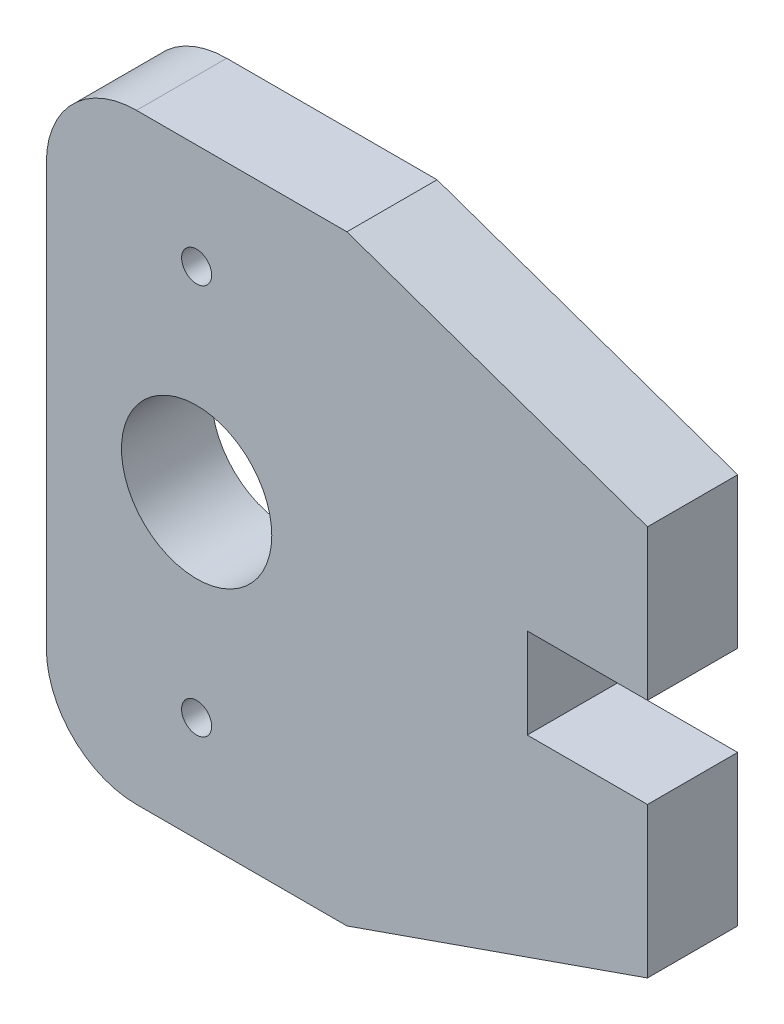
ISO-10303-21;
HEADER;
FILE_DESCRIPTION(('STEP AP214'),'2;1');
FILE_NAME('part.step','',(''),(''),'','','');
FILE_SCHEMA(('AUTOMOTIVE_DESIGN { 1 0 10303 214 1 1 1 1 }'));
ENDSEC;
DATA;
#1=APPLICATION_CONTEXT('core data for automotive mechanical design processes');
#2=APPLICATION_PROTOCOL_DEFINITION('international standard','automotive_design',2000,#1);
#3=PRODUCT_CONTEXT('',#1,'mechanical');
#4=PRODUCT('Part','Part','',(#3));
#5=PRODUCT_RELATED_PRODUCT_CATEGORY('part','',(#4));
#6=PRODUCT_DEFINITION_FORMATION('','',#4);
#7=PRODUCT_DEFINITION_CONTEXT('part definition',#1,'design');
#8=PRODUCT_DEFINITION('design','',#6,#7);
#9=PRODUCT_DEFINITION_SHAPE('','',#8);
#10=(LENGTH_UNIT() NAMED_UNIT(*) SI_UNIT(.MILLI.,.METRE.));
#11=(NAMED_UNIT(*) PLANE_ANGLE_UNIT() SI_UNIT($,.RADIAN.));
#12=(NAMED_UNIT(*) SI_UNIT($,.STERADIAN.) SOLID_ANGLE_UNIT());
#13=UNCERTAINTY_MEASURE_WITH_UNIT(LENGTH_MEASURE(1.E-05),#10,'distance_accuracy_value','');
#14=(GEOMETRIC_REPRESENTATION_CONTEXT(3) GLOBAL_UNCERTAINTY_ASSIGNED_CONTEXT((#13)) GLOBAL_UNIT_ASSIGNED_CONTEXT((#10,
#11,#12)) REPRESENTATION_CONTEXT('',''));
#15=CARTESIAN_POINT('',(0.,0.,0.));
#16=DIRECTION('',(0.,0.,1.));
#17=DIRECTION('',(1.,0.,0.));
#18=AXIS2_PLACEMENT_3D('',#15,#16,#17);
#19=CARTESIAN_POINT('',(0.,0.,3.));
#20=DIRECTION('',(0.,0.,1.));
#21=DIRECTION('',(1.,0.,0.));
#22=AXIS2_PLACEMENT_3D('',#19,#20,#21);
#23=PLANE('',#22);
#24=CARTESIAN_POINT('',(-5.,0.,3.));
#25=DIRECTION('',(0.,0.,1.));
#26=DIRECTION('',(1.,0.,0.));
#27=AXIS2_PLACEMENT_3D('',#24,#25,#26);
#28=CIRCLE('',#27,2.5);
#29=CARTESIAN_POINT('',(-2.5,0.,3.));
#30=VERTEX_POINT('',#29);
#31=EDGE_CURVE('E404',#30,#30,#28,.T.);
#32=ORIENTED_EDGE('',*,*,#31,.F.);
#33=EDGE_LOOP('',(#32));
#34=FACE_BOUND('',#33,.T.);
#35=CARTESIAN_POINT('',(-5.,6.5,3.));
#36=DIRECTION('',(0.,0.,1.));
#37=DIRECTION('',(1.,0.,0.));
#38=AXIS2_PLACEMENT_3D('',#35,#36,#37);
#39=CIRCLE('',#38,0.5);
#40=CARTESIAN_POINT('',(-4.5,6.5,3.));
#41=VERTEX_POINT('',#40);
#42=EDGE_CURVE('E168',#41,#41,#39,.T.);
#43=ORIENTED_EDGE('',*,*,#42,.F.);
#44=EDGE_LOOP('',(#43));
#45=FACE_BOUND('',#44,.T.);
#46=DIRECTION('',(0.,-1.,0.));
#47=VECTOR('',#46,1.);
#48=CARTESIAN_POINT('',(-10.,10.,3.));
#49=LINE('',#48,#47);
#50=CARTESIAN_POINT('',(-10.,7.,3.));
#51=VERTEX_POINT('',#50);
#52=CARTESIAN_POINT('',(-10.,-7.,3.));
#53=VERTEX_POINT('',#52);
#54=EDGE_CURVE('E133',#51,#53,#49,.T.);
#55=ORIENTED_EDGE('',*,*,#54,.T.);
#56=CARTESIAN_POINT('',(-7.,-7.,3.));
#57=DIRECTION('',(0.,0.,1.));
#58=DIRECTION('',(1.,0.,0.));
#59=AXIS2_PLACEMENT_3D('',#56,#57,#58);
#60=CIRCLE('',#59,3.);
#61=CARTESIAN_POINT('',(-7.,-10.,3.));
#62=VERTEX_POINT('',#61);
#63=EDGE_CURVE('E41',#53,#62,#60,.T.);
#64=ORIENTED_EDGE('',*,*,#63,.T.);
#65=DIRECTION('',(1.,0.,0.));
#66=VECTOR('',#65,1.);
#67=CARTESIAN_POINT('',(-10.,-10.,3.));
#68=LINE('',#67,#66);
#69=CARTESIAN_POINT('',(0.,-10.,3.));
#70=VERTEX_POINT('',#69);
#71=EDGE_CURVE('E123',#62,#70,#68,.T.);
#72=ORIENTED_EDGE('',*,*,#71,.T.);
#73=DIRECTION('',(0.943858356366017,0.330350424728106,0.));
#74=VECTOR('',#73,1.);
#75=CARTESIAN_POINT('',(0.,-10.,3.));
#76=LINE('',#75,#74);
#77=CARTESIAN_POINT('',(10.,-6.5,3.));
#78=VERTEX_POINT('',#77);
#79=EDGE_CURVE('E127',#70,#78,#76,.T.);
#80=ORIENTED_EDGE('',*,*,#79,.T.);
#81=DIRECTION('',(0.,1.,0.));
#82=VECTOR('',#81,1.);
#83=CARTESIAN_POINT('',(10.,-1.5,3.));
#84=LINE('',#83,#82);
#85=CARTESIAN_POINT('',(10.,-1.5,3.));
#86=VERTEX_POINT('',#85);
#87=EDGE_CURVE('E148',#78,#86,#84,.T.);
#88=ORIENTED_EDGE('',*,*,#87,.T.);
#89=DIRECTION('',(-1.,0.,0.));
#90=VECTOR('',#89,1.);
#91=CARTESIAN_POINT('',(6.,-1.5,3.));
#92=LINE('',#91,#90);
#93=CARTESIAN_POINT('',(6.,-1.5,3.));
#94=VERTEX_POINT('',#93);
#95=EDGE_CURVE('E150',#86,#94,#92,.T.);
#96=ORIENTED_EDGE('',*,*,#95,.T.);
#97=DIRECTION('',(0.,1.,0.));
#98=VECTOR('',#97,1.);
#99=CARTESIAN_POINT('',(6.,-1.5,3.));
#100=LINE('',#99,#98);
#101=CARTESIAN_POINT('',(6.,1.5,3.));
#102=VERTEX_POINT('',#101);
#103=EDGE_CURVE('E155',#94,#102,#100,.T.);
#104=ORIENTED_EDGE('',*,*,#103,.T.);
#105=DIRECTION('',(1.,0.,0.));
#106=VECTOR('',#105,1.);
#107=CARTESIAN_POINT('',(6.,1.5,3.));
#108=LINE('',#107,#106);
#109=CARTESIAN_POINT('',(10.,1.5,3.));
#110=VERTEX_POINT('',#109);
#111=EDGE_CURVE('E157',#102,#110,#108,.T.);
#112=ORIENTED_EDGE('',*,*,#111,.T.);
#113=DIRECTION('',(0.,1.,0.));
#114=VECTOR('',#113,1.);
#115=CARTESIAN_POINT('',(10.,6.5,3.));
#116=LINE('',#115,#114);
#117=CARTESIAN_POINT('',(10.,6.5,3.));
#118=VERTEX_POINT('',#117);
#119=EDGE_CURVE('E159',#110,#118,#116,.T.);
#120=ORIENTED_EDGE('',*,*,#119,.T.);
#121=DIRECTION('',(-0.943858356366017,0.330350424728106,0.));
#122=VECTOR('',#121,1.);
#123=CARTESIAN_POINT('',(0.,10.,3.));
#124=LINE('',#123,#122);
#125=CARTESIAN_POINT('',(0.,10.,3.));
#126=VERTEX_POINT('',#125);
#127=EDGE_CURVE('E161',#118,#126,#124,.T.);
#128=ORIENTED_EDGE('',*,*,#127,.T.);
#129=DIRECTION('',(-1.,0.,0.));
#130=VECTOR('',#129,1.);
#131=CARTESIAN_POINT('',(-10.,10.,3.));
#132=LINE('',#131,#130);
#133=CARTESIAN_POINT('',(-7.,10.,3.));
#134=VERTEX_POINT('',#133);
#135=EDGE_CURVE('E163',#126,#134,#132,.T.);
#136=ORIENTED_EDGE('',*,*,#135,.T.);
#137=CARTESIAN_POINT('',(-7.,7.,3.));
#138=DIRECTION('',(0.,0.,1.));
#139=DIRECTION('',(1.,0.,0.));
#140=AXIS2_PLACEMENT_3D('',#137,#138,#139);
#141=CIRCLE('',#140,3.);
#142=EDGE_CURVE('E213',#134,#51,#141,.T.);
#143=ORIENTED_EDGE('',*,*,#142,.T.);
#144=EDGE_LOOP('',(#55,#64,#72,#80,#88,#96,#104,#112,#120,#128,#136,#143));
#145=FACE_BOUND('',#144,.T.);
#146=CARTESIAN_POINT('',(-5.,-6.5,3.));
#147=DIRECTION('',(0.,0.,1.));
#148=DIRECTION('',(1.,0.,0.));
#149=AXIS2_PLACEMENT_3D('',#146,#147,#148);
#150=CIRCLE('',#149,0.5);
#151=CARTESIAN_POINT('',(-4.5,-6.5,3.));
#152=VERTEX_POINT('',#151);
#153=EDGE_CURVE('E409',#152,#152,#150,.T.);
#154=ORIENTED_EDGE('',*,*,#153,.F.);
#155=EDGE_LOOP('',(#154));
#156=FACE_BOUND('',#155,.T.);
#157=ADVANCED_FACE('F33',(#34,#45,#145,#156),#23,.T.);
#158=CARTESIAN_POINT('',(0.,0.,0.));
#159=DIRECTION('',(0.,0.,1.));
#160=DIRECTION('',(1.,0.,0.));
#161=AXIS2_PLACEMENT_3D('',#158,#159,#160);
#162=PLANE('',#161);
#163=CARTESIAN_POINT('',(-5.,0.,0.));
#164=DIRECTION('',(0.,0.,1.));
#165=DIRECTION('',(1.,0.,0.));
#166=AXIS2_PLACEMENT_3D('',#163,#164,#165);
#167=CIRCLE('',#166,2.5);
#168=CARTESIAN_POINT('',(-2.5,0.,0.));
#169=VERTEX_POINT('',#168);
#170=EDGE_CURVE('E402',#169,#169,#167,.T.);
#171=ORIENTED_EDGE('',*,*,#170,.T.);
#172=EDGE_LOOP('',(#171));
#173=FACE_BOUND('',#172,.T.);
#174=DIRECTION('',(1.,0.,0.));
#175=VECTOR('',#174,1.);
#176=CARTESIAN_POINT('',(-10.,-10.,0.));
#177=LINE('',#176,#175);
#178=CARTESIAN_POINT('',(-7.,-10.,0.));
#179=VERTEX_POINT('',#178);
#180=CARTESIAN_POINT('',(0.,-10.,0.));
#181=VERTEX_POINT('',#180);
#182=EDGE_CURVE('E139',#179,#181,#177,.T.);
#183=ORIENTED_EDGE('',*,*,#182,.F.);
#184=CARTESIAN_POINT('',(-7.,-7.,0.));
#185=DIRECTION('',(0.,0.,1.));
#186=DIRECTION('',(1.,0.,0.));
#187=AXIS2_PLACEMENT_3D('',#184,#185,#186);
#188=CIRCLE('',#187,3.);
#189=CARTESIAN_POINT('',(-10.,-7.,0.));
#190=VERTEX_POINT('',#189);
#191=EDGE_CURVE('E207',#179,#190,#188,.F.);
#192=ORIENTED_EDGE('',*,*,#191,.T.);
#193=DIRECTION('',(0.,-1.,0.));
#194=VECTOR('',#193,1.);
#195=CARTESIAN_POINT('',(-10.,10.,0.));
#196=LINE('',#195,#194);
#197=CARTESIAN_POINT('',(-10.,7.,0.));
#198=VERTEX_POINT('',#197);
#199=EDGE_CURVE('E166',#198,#190,#196,.T.);
#200=ORIENTED_EDGE('',*,*,#199,.F.);
#201=CARTESIAN_POINT('',(-7.,7.,0.));
#202=DIRECTION('',(0.,0.,1.));
#203=DIRECTION('',(1.,0.,0.));
#204=AXIS2_PLACEMENT_3D('',#201,#202,#203);
#205=CIRCLE('',#204,3.);
#206=CARTESIAN_POINT('',(-7.,10.,0.));
#207=VERTEX_POINT('',#206);
#208=EDGE_CURVE('E205',#198,#207,#205,.F.);
#209=ORIENTED_EDGE('',*,*,#208,.T.);
#210=DIRECTION('',(-1.,0.,0.));
#211=VECTOR('',#210,1.);
#212=CARTESIAN_POINT('',(-10.,10.,0.));
#213=LINE('',#212,#211);
#214=CARTESIAN_POINT('',(0.,10.,0.));
#215=VERTEX_POINT('',#214);
#216=EDGE_CURVE('E184',#215,#207,#213,.T.);
#217=ORIENTED_EDGE('',*,*,#216,.F.);
#218=DIRECTION('',(-0.943858356366017,0.330350424728106,0.));
#219=VECTOR('',#218,1.);
#220=CARTESIAN_POINT('',(0.,10.,0.));
#221=LINE('',#220,#219);
#222=CARTESIAN_POINT('',(10.,6.5,0.));
#223=VERTEX_POINT('',#222);
#224=EDGE_CURVE('E182',#223,#215,#221,.T.);
#225=ORIENTED_EDGE('',*,*,#224,.F.);
#226=DIRECTION('',(0.,1.,0.));
#227=VECTOR('',#226,1.);
#228=CARTESIAN_POINT('',(10.,6.5,0.));
#229=LINE('',#228,#227);
#230=CARTESIAN_POINT('',(10.,1.5,0.));
#231=VERTEX_POINT('',#230);
#232=EDGE_CURVE('E180',#231,#223,#229,.T.);
#233=ORIENTED_EDGE('',*,*,#232,.F.);
#234=DIRECTION('',(1.,0.,0.));
#235=VECTOR('',#234,1.);
#236=CARTESIAN_POINT('',(6.,1.5,0.));
#237=LINE('',#236,#235);
#238=CARTESIAN_POINT('',(6.,1.5,0.));
#239=VERTEX_POINT('',#238);
#240=EDGE_CURVE('E178',#239,#231,#237,.T.);
#241=ORIENTED_EDGE('',*,*,#240,.F.);
#242=DIRECTION('',(0.,1.,0.));
#243=VECTOR('',#242,1.);
#244=CARTESIAN_POINT('',(6.,-1.5,0.));
#245=LINE('',#244,#243);
#246=CARTESIAN_POINT('',(6.,-1.5,0.));
#247=VERTEX_POINT('',#246);
#248=EDGE_CURVE('E176',#247,#239,#245,.T.);
#249=ORIENTED_EDGE('',*,*,#248,.F.);
#250=DIRECTION('',(-1.,0.,0.));
#251=VECTOR('',#250,1.);
#252=CARTESIAN_POINT('',(6.,-1.5,0.));
#253=LINE('',#252,#251);
#254=CARTESIAN_POINT('',(10.,-1.5,0.));
#255=VERTEX_POINT('',#254);
#256=EDGE_CURVE('E174',#255,#247,#253,.T.);
#257=ORIENTED_EDGE('',*,*,#256,.F.);
#258=DIRECTION('',(0.,1.,0.));
#259=VECTOR('',#258,1.);
#260=CARTESIAN_POINT('',(10.,-1.5,0.));
#261=LINE('',#260,#259);
#262=CARTESIAN_POINT('',(10.,-6.5,0.));
#263=VERTEX_POINT('',#262);
#264=EDGE_CURVE('E172',#263,#255,#261,.T.);
#265=ORIENTED_EDGE('',*,*,#264,.F.);
#266=DIRECTION('',(0.943858356366017,0.330350424728106,0.));
#267=VECTOR('',#266,1.);
#268=CARTESIAN_POINT('',(0.,-10.,0.));
#269=LINE('',#268,#267);
#270=EDGE_CURVE('E170',#181,#263,#269,.T.);
#271=ORIENTED_EDGE('',*,*,#270,.F.);
#272=EDGE_LOOP('',(#183,#192,#200,#209,#217,#225,#233,#241,#249,#257,#265,#271));
#273=FACE_BOUND('',#272,.T.);
#274=CARTESIAN_POINT('',(-5.,6.5,0.));
#275=DIRECTION('',(0.,0.,1.));
#276=DIRECTION('',(1.,0.,0.));
#277=AXIS2_PLACEMENT_3D('',#274,#275,#276);
#278=CIRCLE('',#277,0.5);
#279=CARTESIAN_POINT('',(-4.5,6.5,0.));
#280=VERTEX_POINT('',#279);
#281=EDGE_CURVE('E412',#280,#280,#278,.T.);
#282=ORIENTED_EDGE('',*,*,#281,.T.);
#283=EDGE_LOOP('',(#282));
#284=FACE_BOUND('',#283,.T.);
#285=CARTESIAN_POINT('',(-5.,-6.5,0.));
#286=DIRECTION('',(0.,0.,1.));
#287=DIRECTION('',(1.,0.,0.));
#288=AXIS2_PLACEMENT_3D('',#285,#286,#287);
#289=CIRCLE('',#288,0.5);
#290=CARTESIAN_POINT('',(-4.5,-6.5,0.));
#291=VERTEX_POINT('',#290);
#292=EDGE_CURVE('E406',#291,#291,#289,.T.);
#293=ORIENTED_EDGE('',*,*,#292,.T.);
#294=EDGE_LOOP('',(#293));
#295=FACE_BOUND('',#294,.T.);
#296=ADVANCED_FACE('F221',(#173,#273,#284,#295),#162,.F.);
#297=CARTESIAN_POINT('',(-10.,10.,3.));
#298=DIRECTION('',(1.,0.,0.));
#299=DIRECTION('',(0.,1.,0.));
#300=AXIS2_PLACEMENT_3D('',#297,#298,#299);
#301=PLANE('',#300);
#302=ORIENTED_EDGE('',*,*,#199,.T.);
#303=DIRECTION('',(0.,0.,-1.));
#304=VECTOR('',#303,1.);
#305=CARTESIAN_POINT('',(-10.,-7.,3.));
#306=LINE('',#305,#304);
#307=EDGE_CURVE('E54',#190,#53,#306,.F.);
#308=ORIENTED_EDGE('',*,*,#307,.T.);
#309=ORIENTED_EDGE('',*,*,#54,.F.);
#310=DIRECTION('',(0.,0.,-1.));
#311=VECTOR('',#310,1.);
#312=CARTESIAN_POINT('',(-10.,7.,3.));
#313=LINE('',#312,#311);
#314=EDGE_CURVE('E209',#51,#198,#313,.T.);
#315=ORIENTED_EDGE('',*,*,#314,.T.);
#316=EDGE_LOOP('',(#302,#308,#309,#315));
#317=FACE_BOUND('',#316,.T.);
#318=ADVANCED_FACE('F217',(#317),#301,.F.);
#319=CARTESIAN_POINT('',(-10.,-10.,3.));
#320=DIRECTION('',(0.,1.,0.));
#321=DIRECTION('',(0.,0.,1.));
#322=AXIS2_PLACEMENT_3D('',#319,#320,#321);
#323=PLANE('',#322);
#324=ORIENTED_EDGE('',*,*,#71,.F.);
#325=DIRECTION('',(0.,0.,-1.));
#326=VECTOR('',#325,1.);
#327=CARTESIAN_POINT('',(-7.,-10.,3.));
#328=LINE('',#327,#326);
#329=EDGE_CURVE('E142',#62,#179,#328,.T.);
#330=ORIENTED_EDGE('',*,*,#329,.T.);
#331=ORIENTED_EDGE('',*,*,#182,.T.);
#332=DIRECTION('',(0.,0.,-1.));
#333=VECTOR('',#332,1.);
#334=CARTESIAN_POINT('',(0.,-10.,3.));
#335=LINE('',#334,#333);
#336=EDGE_CURVE('E136',#70,#181,#335,.T.);
#337=ORIENTED_EDGE('',*,*,#336,.F.);
#338=EDGE_LOOP('',(#324,#330,#331,#337));
#339=FACE_BOUND('',#338,.T.);
#340=ADVANCED_FACE('F137',(#339),#323,.F.);
#341=CARTESIAN_POINT('',(0.,-10.,3.));
#342=DIRECTION('',(-0.330350424728106,0.943858356366017,0.));
#343=DIRECTION('',(-0.943858356366018,-0.330350424728106,0.));
#344=AXIS2_PLACEMENT_3D('',#341,#342,#343);
#345=PLANE('',#344);
#346=ORIENTED_EDGE('',*,*,#270,.T.);
#347=DIRECTION('',(0.,0.,-1.));
#348=VECTOR('',#347,1.);
#349=CARTESIAN_POINT('',(10.,-6.5,3.));
#350=LINE('',#349,#348);
#351=EDGE_CURVE('E143',#78,#263,#350,.T.);
#352=ORIENTED_EDGE('',*,*,#351,.F.);
#353=ORIENTED_EDGE('',*,*,#79,.F.);
#354=ORIENTED_EDGE('',*,*,#336,.T.);
#355=EDGE_LOOP('',(#346,#352,#353,#354));
#356=FACE_BOUND('',#355,.T.);
#357=ADVANCED_FACE('F145',(#356),#345,.F.);
#358=CARTESIAN_POINT('',(10.,-1.5,3.));
#359=DIRECTION('',(-1.,0.,0.));
#360=DIRECTION('',(0.,0.,1.));
#361=AXIS2_PLACEMENT_3D('',#358,#359,#360);
#362=PLANE('',#361);
#363=ORIENTED_EDGE('',*,*,#264,.T.);
#364=DIRECTION('',(0.,0.,-1.));
#365=VECTOR('',#364,1.);
#366=CARTESIAN_POINT('',(10.,-1.5,3.));
#367=LINE('',#366,#365);
#368=EDGE_CURVE('E200',#86,#255,#367,.T.);
#369=ORIENTED_EDGE('',*,*,#368,.F.);
#370=ORIENTED_EDGE('',*,*,#87,.F.);
#371=ORIENTED_EDGE('',*,*,#351,.T.);
#372=EDGE_LOOP('',(#363,#369,#370,#371));
#373=FACE_BOUND('',#372,.T.);
#374=ADVANCED_FACE('F252',(#373),#362,.F.);
#375=CARTESIAN_POINT('',(6.,-1.5,3.));
#376=DIRECTION('',(0.,-1.,0.));
#377=DIRECTION('',(1.,0.,0.));
#378=AXIS2_PLACEMENT_3D('',#375,#376,#377);
#379=PLANE('',#378);
#380=ORIENTED_EDGE('',*,*,#256,.T.);
#381=DIRECTION('',(0.,0.,-1.));
#382=VECTOR('',#381,1.);
#383=CARTESIAN_POINT('',(6.,-1.5,3.));
#384=LINE('',#383,#382);
#385=EDGE_CURVE('E197',#94,#247,#384,.T.);
#386=ORIENTED_EDGE('',*,*,#385,.F.);
#387=ORIENTED_EDGE('',*,*,#95,.F.);
#388=ORIENTED_EDGE('',*,*,#368,.T.);
#389=EDGE_LOOP('',(#380,#386,#387,#388));
#390=FACE_BOUND('',#389,.T.);
#391=ADVANCED_FACE('F248',(#390),#379,.F.);
#392=CARTESIAN_POINT('',(6.,-1.5,3.));
#393=DIRECTION('',(-1.,0.,0.));
#394=DIRECTION('',(0.,0.,1.));
#395=AXIS2_PLACEMENT_3D('',#392,#393,#394);
#396=PLANE('',#395);
#397=ORIENTED_EDGE('',*,*,#248,.T.);
#398=DIRECTION('',(0.,0.,-1.));
#399=VECTOR('',#398,1.);
#400=CARTESIAN_POINT('',(6.,1.5,3.));
#401=LINE('',#400,#399);
#402=EDGE_CURVE('E194',#102,#239,#401,.T.);
#403=ORIENTED_EDGE('',*,*,#402,.F.);
#404=ORIENTED_EDGE('',*,*,#103,.F.);
#405=ORIENTED_EDGE('',*,*,#385,.T.);
#406=EDGE_LOOP('',(#397,#403,#404,#405));
#407=FACE_BOUND('',#406,.T.);
#408=ADVANCED_FACE('F243',(#407),#396,.F.);
#409=CARTESIAN_POINT('',(6.,1.5,3.));
#410=DIRECTION('',(0.,1.,0.));
#411=DIRECTION('',(-1.,0.,0.));
#412=AXIS2_PLACEMENT_3D('',#409,#410,#411);
#413=PLANE('',#412);
#414=ORIENTED_EDGE('',*,*,#240,.T.);
#415=DIRECTION('',(0.,0.,-1.));
#416=VECTOR('',#415,1.);
#417=CARTESIAN_POINT('',(10.,1.5,3.));
#418=LINE('',#417,#416);
#419=EDGE_CURVE('E191',#110,#231,#418,.T.);
#420=ORIENTED_EDGE('',*,*,#419,.F.);
#421=ORIENTED_EDGE('',*,*,#111,.F.);
#422=ORIENTED_EDGE('',*,*,#402,.T.);
#423=EDGE_LOOP('',(#414,#420,#421,#422));
#424=FACE_BOUND('',#423,.T.);
#425=ADVANCED_FACE('F239',(#424),#413,.F.);
#426=CARTESIAN_POINT('',(10.,6.5,3.));
#427=DIRECTION('',(-1.,0.,0.));
#428=DIRECTION('',(0.,0.,1.));
#429=AXIS2_PLACEMENT_3D('',#426,#427,#428);
#430=PLANE('',#429);
#431=ORIENTED_EDGE('',*,*,#232,.T.);
#432=DIRECTION('',(0.,0.,-1.));
#433=VECTOR('',#432,1.);
#434=CARTESIAN_POINT('',(10.,6.5,3.));
#435=LINE('',#434,#433);
#436=EDGE_CURVE('E188',#118,#223,#435,.T.);
#437=ORIENTED_EDGE('',*,*,#436,.F.);
#438=ORIENTED_EDGE('',*,*,#119,.F.);
#439=ORIENTED_EDGE('',*,*,#419,.T.);
#440=EDGE_LOOP('',(#431,#437,#438,#439));
#441=FACE_BOUND('',#440,.T.);
#442=ADVANCED_FACE('F234',(#441),#430,.F.);
#443=CARTESIAN_POINT('',(0.,10.,3.));
#444=DIRECTION('',(-0.330350424728106,-0.943858356366017,0.));
#445=DIRECTION('',(0.943858356366017,-0.330350424728106,0.));
#446=AXIS2_PLACEMENT_3D('',#443,#444,#445);
#447=PLANE('',#446);
#448=ORIENTED_EDGE('',*,*,#224,.T.);
#449=DIRECTION('',(0.,0.,-1.));
#450=VECTOR('',#449,1.);
#451=CARTESIAN_POINT('',(0.,10.,3.));
#452=LINE('',#451,#450);
#453=EDGE_CURVE('E165',#126,#215,#452,.T.);
#454=ORIENTED_EDGE('',*,*,#453,.F.);
#455=ORIENTED_EDGE('',*,*,#127,.F.);
#456=ORIENTED_EDGE('',*,*,#436,.T.);
#457=EDGE_LOOP('',(#448,#454,#455,#456));
#458=FACE_BOUND('',#457,.T.);
#459=ADVANCED_FACE('F228',(#458),#447,.F.);
#460=CARTESIAN_POINT('',(-10.,10.,3.));
#461=DIRECTION('',(0.,-1.,0.));
#462=DIRECTION('',(0.,0.,-1.));
#463=AXIS2_PLACEMENT_3D('',#460,#461,#462);
#464=PLANE('',#463);
#465=ORIENTED_EDGE('',*,*,#216,.T.);
#466=DIRECTION('',(0.,0.,-1.));
#467=VECTOR('',#466,1.);
#468=CARTESIAN_POINT('',(-7.,10.,3.));
#469=LINE('',#468,#467);
#470=EDGE_CURVE('E11',#207,#134,#469,.F.);
#471=ORIENTED_EDGE('',*,*,#470,.T.);
#472=ORIENTED_EDGE('',*,*,#135,.F.);
#473=ORIENTED_EDGE('',*,*,#453,.T.);
#474=EDGE_LOOP('',(#465,#471,#472,#473));
#475=FACE_BOUND('',#474,.T.);
#476=ADVANCED_FACE('F224',(#475),#464,.F.);
#477=CARTESIAN_POINT('',(-5.,6.5,3.));
#478=DIRECTION('',(0.,0.,-1.));
#479=DIRECTION('',(-1.,0.,0.));
#480=AXIS2_PLACEMENT_3D('',#477,#478,#479);
#481=CYLINDRICAL_SURFACE('',#480,0.5);
#482=ORIENTED_EDGE('',*,*,#42,.T.);
#483=EDGE_LOOP('',(#482));
#484=FACE_BOUND('',#483,.T.);
#485=ORIENTED_EDGE('',*,*,#281,.F.);
#486=EDGE_LOOP('',(#485));
#487=FACE_BOUND('',#486,.T.);
#488=ADVANCED_FACE('F272',(#484,#487),#481,.F.);
#489=CARTESIAN_POINT('',(-5.,-6.5,3.));
#490=DIRECTION('',(0.,0.,-1.));
#491=DIRECTION('',(-1.,0.,0.));
#492=AXIS2_PLACEMENT_3D('',#489,#490,#491);
#493=CYLINDRICAL_SURFACE('',#492,0.5);
#494=ORIENTED_EDGE('',*,*,#153,.T.);
#495=EDGE_LOOP('',(#494));
#496=FACE_BOUND('',#495,.T.);
#497=ORIENTED_EDGE('',*,*,#292,.F.);
#498=EDGE_LOOP('',(#497));
#499=FACE_BOUND('',#498,.T.);
#500=ADVANCED_FACE('F312',(#496,#499),#493,.F.);
#501=CARTESIAN_POINT('',(-7.,-7.,3.));
#502=DIRECTION('',(0.,0.,-1.));
#503=DIRECTION('',(-1.,0.,0.));
#504=AXIS2_PLACEMENT_3D('',#501,#502,#503);
#505=CYLINDRICAL_SURFACE('',#504,3.);
#506=ORIENTED_EDGE('',*,*,#63,.F.);
#507=ORIENTED_EDGE('',*,*,#307,.F.);
#508=ORIENTED_EDGE('',*,*,#191,.F.);
#509=ORIENTED_EDGE('',*,*,#329,.F.);
#510=EDGE_LOOP('',(#506,#507,#508,#509));
#511=FACE_BOUND('',#510,.T.);
#512=ADVANCED_FACE('F319',(#511),#505,.T.);
#513=CARTESIAN_POINT('',(-7.,7.,3.));
#514=DIRECTION('',(0.,0.,-1.));
#515=DIRECTION('',(-1.,0.,0.));
#516=AXIS2_PLACEMENT_3D('',#513,#514,#515);
#517=CYLINDRICAL_SURFACE('',#516,3.);
#518=ORIENTED_EDGE('',*,*,#142,.F.);
#519=ORIENTED_EDGE('',*,*,#470,.F.);
#520=ORIENTED_EDGE('',*,*,#208,.F.);
#521=ORIENTED_EDGE('',*,*,#314,.F.);
#522=EDGE_LOOP('',(#518,#519,#520,#521));
#523=FACE_BOUND('',#522,.T.);
#524=ADVANCED_FACE('F35',(#523),#517,.T.);
#525=CARTESIAN_POINT('',(-5.,0.,0.));
#526=DIRECTION('',(0.,0.,1.));
#527=DIRECTION('',(1.,0.,0.));
#528=AXIS2_PLACEMENT_3D('',#525,#526,#527);
#529=CYLINDRICAL_SURFACE('',#528,2.5);
#530=ORIENTED_EDGE('',*,*,#170,.F.);
#531=EDGE_LOOP('',(#530));
#532=FACE_BOUND('',#531,.T.);
#533=ORIENTED_EDGE('',*,*,#31,.T.);
#534=EDGE_LOOP('',(#533));
#535=FACE_BOUND('',#534,.T.);
#536=ADVANCED_FACE('F332',(#532,#535),#529,.F.);
#537=CLOSED_SHELL('',(#157,#296,#318,#340,#357,#374,#391,#408,#425,#442,#459,#476,#488,#500,
#512,#524,#536));
#538=MANIFOLD_SOLID_BREP('B2',#537);
#539=ADVANCED_BREP_SHAPE_REPRESENTATION('',(#18,#538),#14);
#540=SHAPE_DEFINITION_REPRESENTATION(#9,#539);
ENDSEC;
END-ISO-10303-21;
